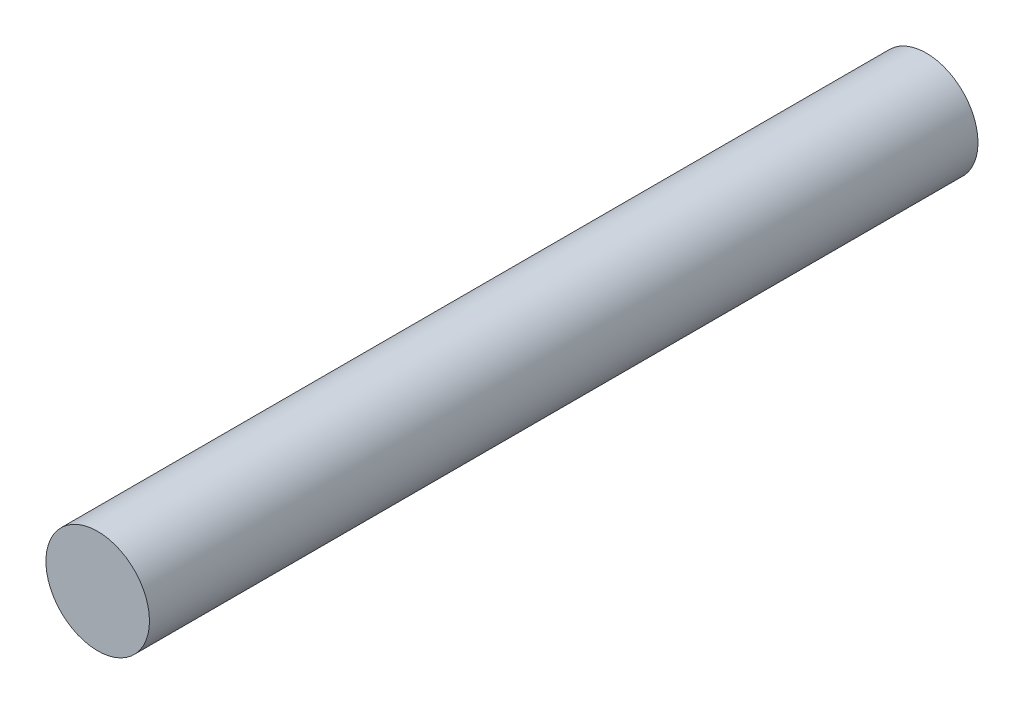
ISO-10303-21;
HEADER;
FILE_DESCRIPTION(('STEP AP214'),'2;1');
FILE_NAME('part.step','',(''),(''),'','','');
FILE_SCHEMA(('AUTOMOTIVE_DESIGN { 1 0 10303 214 1 1 1 1 }'));
ENDSEC;
DATA;
#1=APPLICATION_CONTEXT('core data for automotive mechanical design processes');
#2=APPLICATION_PROTOCOL_DEFINITION('international standard','automotive_design',2000,#1);
#3=PRODUCT_CONTEXT('',#1,'mechanical');
#4=PRODUCT('Part','Part','',(#3));
#5=PRODUCT_RELATED_PRODUCT_CATEGORY('part','',(#4));
#6=PRODUCT_DEFINITION_FORMATION('','',#4);
#7=PRODUCT_DEFINITION_CONTEXT('part definition',#1,'design');
#8=PRODUCT_DEFINITION('design','',#6,#7);
#9=PRODUCT_DEFINITION_SHAPE('','',#8);
#10=(LENGTH_UNIT() NAMED_UNIT(*) SI_UNIT(.MILLI.,.METRE.));
#11=(NAMED_UNIT(*) PLANE_ANGLE_UNIT() SI_UNIT($,.RADIAN.));
#12=(NAMED_UNIT(*) SI_UNIT($,.STERADIAN.) SOLID_ANGLE_UNIT());
#13=UNCERTAINTY_MEASURE_WITH_UNIT(LENGTH_MEASURE(1.E-05),#10,'distance_accuracy_value','');
#14=(GEOMETRIC_REPRESENTATION_CONTEXT(3) GLOBAL_UNCERTAINTY_ASSIGNED_CONTEXT((#13)) GLOBAL_UNIT_ASSIGNED_CONTEXT((#10,
#11,#12)) REPRESENTATION_CONTEXT('',''));
#15=CARTESIAN_POINT('',(0.,0.,0.));
#16=DIRECTION('',(0.,0.,1.));
#17=DIRECTION('',(1.,0.,0.));
#18=AXIS2_PLACEMENT_3D('',#15,#16,#17);
#19=CARTESIAN_POINT('',(0.,0.,13.6));
#20=DIRECTION('',(0.,0.,-1.));
#21=DIRECTION('',(-1.,0.,0.));
#22=AXIS2_PLACEMENT_3D('',#19,#20,#21);
#23=CYLINDRICAL_SURFACE('',#22,0.85);
#24=CARTESIAN_POINT('',(0.,0.,13.6));
#25=DIRECTION('',(0.,0.,1.));
#26=DIRECTION('',(1.,0.,0.));
#27=AXIS2_PLACEMENT_3D('',#24,#25,#26);
#28=CIRCLE('',#27,0.85);
#29=CARTESIAN_POINT('',(0.85,0.,13.6));
#30=VERTEX_POINT('',#29);
#31=EDGE_CURVE('E10',#30,#30,#28,.T.);
#32=ORIENTED_EDGE('',*,*,#31,.F.);
#33=EDGE_LOOP('',(#32));
#34=FACE_BOUND('',#33,.T.);
#35=CARTESIAN_POINT('',(0.,0.,0.));
#36=DIRECTION('',(0.,0.,1.));
#37=DIRECTION('',(1.,0.,0.));
#38=AXIS2_PLACEMENT_3D('',#35,#36,#37);
#39=CIRCLE('',#38,0.85);
#40=CARTESIAN_POINT('',(0.85,0.,0.));
#41=VERTEX_POINT('',#40);
#42=EDGE_CURVE('E50',#41,#41,#39,.T.);
#43=ORIENTED_EDGE('',*,*,#42,.T.);
#44=EDGE_LOOP('',(#43));
#45=FACE_BOUND('',#44,.T.);
#46=ADVANCED_FACE('F47',(#34,#45),#23,.T.);
#47=CARTESIAN_POINT('',(0.,0.,13.6));
#48=DIRECTION('',(0.,0.,1.));
#49=DIRECTION('',(1.,0.,0.));
#50=AXIS2_PLACEMENT_3D('',#47,#48,#49);
#51=PLANE('',#50);
#52=ORIENTED_EDGE('',*,*,#31,.T.);
#53=EDGE_LOOP('',(#52));
#54=FACE_BOUND('',#53,.T.);
#55=ADVANCED_FACE('F66',(#54),#51,.T.);
#56=CARTESIAN_POINT('',(0.,0.,0.));
#57=DIRECTION('',(0.,0.,1.));
#58=DIRECTION('',(1.,0.,0.));
#59=AXIS2_PLACEMENT_3D('',#56,#57,#58);
#60=PLANE('',#59);
#61=ORIENTED_EDGE('',*,*,#42,.F.);
#62=EDGE_LOOP('',(#61));
#63=FACE_BOUND('',#62,.T.);
#64=ADVANCED_FACE('F64',(#63),#60,.F.);
#65=CLOSED_SHELL('',(#46,#55,#64));
#66=MANIFOLD_SOLID_BREP('B2',#65);
#67=ADVANCED_BREP_SHAPE_REPRESENTATION('',(#18,#66),#14);
#68=SHAPE_DEFINITION_REPRESENTATION(#9,#67);
ENDSEC;
END-ISO-10303-21;
